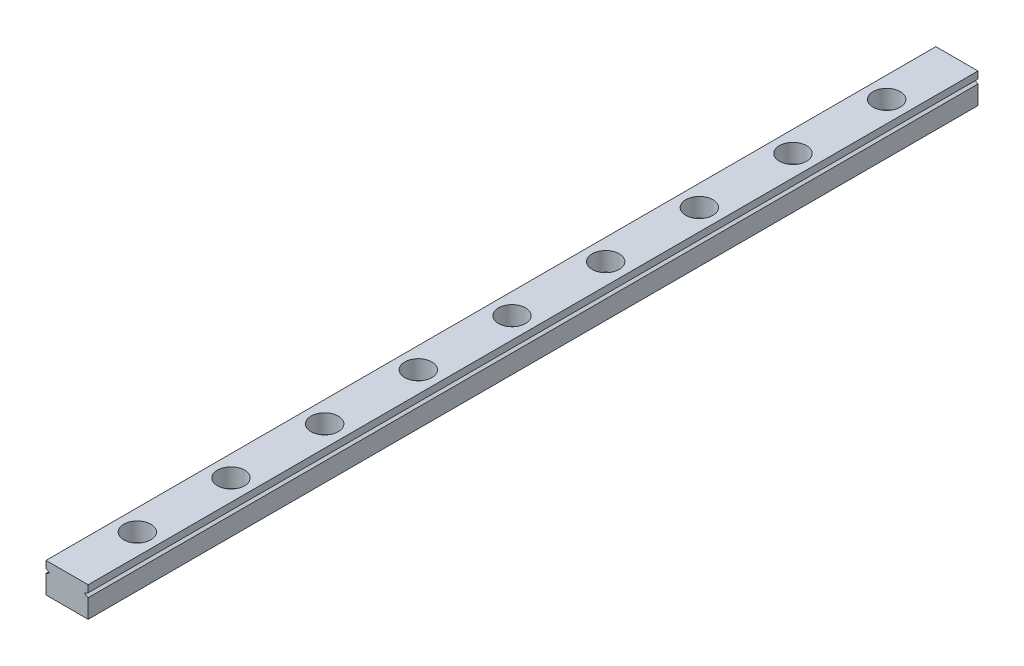
ISO-10303-21;
HEADER;
FILE_DESCRIPTION(('STEP AP214'),'2;1');
FILE_NAME('part.step','',(''),(''),'','','');
FILE_SCHEMA(('AUTOMOTIVE_DESIGN { 1 0 10303 214 1 1 1 1 }'));
ENDSEC;
DATA;
#1=APPLICATION_CONTEXT('core data for automotive mechanical design processes');
#2=APPLICATION_PROTOCOL_DEFINITION('international standard','automotive_design',2000,#1);
#3=PRODUCT_CONTEXT('',#1,'mechanical');
#4=PRODUCT('Part','Part','',(#3));
#5=PRODUCT_RELATED_PRODUCT_CATEGORY('part','',(#4));
#6=PRODUCT_DEFINITION_FORMATION('','',#4);
#7=PRODUCT_DEFINITION_CONTEXT('part definition',#1,'design');
#8=PRODUCT_DEFINITION('design','',#6,#7);
#9=PRODUCT_DEFINITION_SHAPE('','',#8);
#10=(LENGTH_UNIT() NAMED_UNIT(*) SI_UNIT(.MILLI.,.METRE.));
#11=(NAMED_UNIT(*) PLANE_ANGLE_UNIT() SI_UNIT($,.RADIAN.));
#12=(NAMED_UNIT(*) SI_UNIT($,.STERADIAN.) SOLID_ANGLE_UNIT());
#13=UNCERTAINTY_MEASURE_WITH_UNIT(LENGTH_MEASURE(1.E-05),#10,'distance_accuracy_value','');
#14=(GEOMETRIC_REPRESENTATION_CONTEXT(3) GLOBAL_UNCERTAINTY_ASSIGNED_CONTEXT((#13)) GLOBAL_UNIT_ASSIGNED_CONTEXT((#10,
#11,#12)) REPRESENTATION_CONTEXT('',''));
#15=CARTESIAN_POINT('',(0.,0.,0.));
#16=DIRECTION('',(0.,0.,1.));
#17=DIRECTION('',(1.,0.,0.));
#18=AXIS2_PLACEMENT_3D('',#15,#16,#17);
#19=CARTESIAN_POINT('',(0.,4.,190.));
#20=DIRECTION('',(1.,0.,0.));
#21=DIRECTION('',(0.,0.,-1.));
#22=AXIS2_PLACEMENT_3D('',#19,#20,#21);
#23=PLANE('',#22);
#24=DIRECTION('',(0.,-1.,0.));
#25=VECTOR('',#24,1.);
#26=CARTESIAN_POINT('',(0.,4.,0.));
#27=LINE('',#26,#25);
#28=CARTESIAN_POINT('',(0.,4.,0.));
#29=VERTEX_POINT('',#28);
#30=CARTESIAN_POINT('',(0.,0.,0.));
#31=VERTEX_POINT('',#30);
#32=EDGE_CURVE('E141',#29,#31,#27,.T.);
#33=ORIENTED_EDGE('',*,*,#32,.T.);
#34=DIRECTION('',(0.,0.,-1.));
#35=VECTOR('',#34,1.);
#36=CARTESIAN_POINT('',(0.,0.,190.));
#37=LINE('',#36,#35);
#38=CARTESIAN_POINT('',(0.,0.,190.));
#39=VERTEX_POINT('',#38);
#40=EDGE_CURVE('E11',#39,#31,#37,.T.);
#41=ORIENTED_EDGE('',*,*,#40,.F.);
#42=DIRECTION('',(0.,-1.,0.));
#43=VECTOR('',#42,1.);
#44=CARTESIAN_POINT('',(0.,4.,190.));
#45=LINE('',#44,#43);
#46=CARTESIAN_POINT('',(0.,4.,190.));
#47=VERTEX_POINT('',#46);
#48=EDGE_CURVE('E160',#47,#39,#45,.T.);
#49=ORIENTED_EDGE('',*,*,#48,.F.);
#50=DIRECTION('',(0.,0.,-1.));
#51=VECTOR('',#50,1.);
#52=CARTESIAN_POINT('',(0.,4.,190.));
#53=LINE('',#52,#51);
#54=EDGE_CURVE('E137',#47,#29,#53,.T.);
#55=ORIENTED_EDGE('',*,*,#54,.T.);
#56=EDGE_LOOP('',(#33,#41,#49,#55));
#57=FACE_BOUND('',#56,.T.);
#58=ADVANCED_FACE('F33',(#57),#23,.F.);
#59=CARTESIAN_POINT('',(0.,0.,190.));
#60=DIRECTION('',(0.,1.,0.));
#61=DIRECTION('',(0.,0.,1.));
#62=AXIS2_PLACEMENT_3D('',#59,#60,#61);
#63=PLANE('',#62);
#64=CARTESIAN_POINT('',(4.5,0.,175.));
#65=DIRECTION('',(0.,1.,0.));
#66=DIRECTION('',(0.,0.,1.));
#67=AXIS2_PLACEMENT_3D('',#64,#65,#66);
#68=CIRCLE('',#67,1.70000000000001);
#69=CARTESIAN_POINT('',(4.5,0.,176.7));
#70=VERTEX_POINT('',#69);
#71=EDGE_CURVE('E211',#70,#70,#68,.T.);
#72=ORIENTED_EDGE('',*,*,#71,.T.);
#73=EDGE_LOOP('',(#72));
#74=FACE_BOUND('',#73,.T.);
#75=CARTESIAN_POINT('',(4.49999999999993,0.,155.));
#76=DIRECTION('',(0.,1.,0.));
#77=DIRECTION('',(0.,0.,1.));
#78=AXIS2_PLACEMENT_3D('',#75,#76,#77);
#79=CIRCLE('',#78,1.70000000000001);
#80=CARTESIAN_POINT('',(4.49999999999993,0.,156.7));
#81=VERTEX_POINT('',#80);
#82=EDGE_CURVE('E306',#81,#81,#79,.T.);
#83=ORIENTED_EDGE('',*,*,#82,.T.);
#84=EDGE_LOOP('',(#83));
#85=FACE_BOUND('',#84,.T.);
#86=CARTESIAN_POINT('',(4.49999999999986,0.,135.));
#87=DIRECTION('',(0.,1.,0.));
#88=DIRECTION('',(0.,0.,1.));
#89=AXIS2_PLACEMENT_3D('',#86,#87,#88);
#90=CIRCLE('',#89,1.70000000000001);
#91=CARTESIAN_POINT('',(4.49999999999986,0.,136.7));
#92=VERTEX_POINT('',#91);
#93=EDGE_CURVE('E300',#92,#92,#90,.T.);
#94=ORIENTED_EDGE('',*,*,#93,.T.);
#95=EDGE_LOOP('',(#94));
#96=FACE_BOUND('',#95,.T.);
#97=CARTESIAN_POINT('',(4.49999999999979,0.,115.));
#98=DIRECTION('',(0.,1.,0.));
#99=DIRECTION('',(0.,0.,1.));
#100=AXIS2_PLACEMENT_3D('',#97,#98,#99);
#101=CIRCLE('',#100,1.70000000000001);
#102=CARTESIAN_POINT('',(4.49999999999979,0.,116.7));
#103=VERTEX_POINT('',#102);
#104=EDGE_CURVE('E294',#103,#103,#101,.T.);
#105=ORIENTED_EDGE('',*,*,#104,.T.);
#106=EDGE_LOOP('',(#105));
#107=FACE_BOUND('',#106,.T.);
#108=CARTESIAN_POINT('',(4.49999999999972,0.,95.));
#109=DIRECTION('',(0.,1.,0.));
#110=DIRECTION('',(0.,0.,1.));
#111=AXIS2_PLACEMENT_3D('',#108,#109,#110);
#112=CIRCLE('',#111,1.70000000000001);
#113=CARTESIAN_POINT('',(4.49999999999972,0.,96.7));
#114=VERTEX_POINT('',#113);
#115=EDGE_CURVE('E288',#114,#114,#112,.T.);
#116=ORIENTED_EDGE('',*,*,#115,.T.);
#117=EDGE_LOOP('',(#116));
#118=FACE_BOUND('',#117,.T.);
#119=CARTESIAN_POINT('',(4.49999999999965,0.,75.));
#120=DIRECTION('',(0.,1.,0.));
#121=DIRECTION('',(0.,0.,1.));
#122=AXIS2_PLACEMENT_3D('',#119,#120,#121);
#123=CIRCLE('',#122,1.70000000000001);
#124=CARTESIAN_POINT('',(4.49999999999965,0.,76.7));
#125=VERTEX_POINT('',#124);
#126=EDGE_CURVE('E282',#125,#125,#123,.T.);
#127=ORIENTED_EDGE('',*,*,#126,.T.);
#128=EDGE_LOOP('',(#127));
#129=FACE_BOUND('',#128,.T.);
#130=CARTESIAN_POINT('',(4.49999999999958,0.,55.));
#131=DIRECTION('',(0.,1.,0.));
#132=DIRECTION('',(0.,0.,1.));
#133=AXIS2_PLACEMENT_3D('',#130,#131,#132);
#134=CIRCLE('',#133,1.7);
#135=CARTESIAN_POINT('',(4.49999999999958,0.,56.7));
#136=VERTEX_POINT('',#135);
#137=EDGE_CURVE('E276',#136,#136,#134,.T.);
#138=ORIENTED_EDGE('',*,*,#137,.T.);
#139=EDGE_LOOP('',(#138));
#140=FACE_BOUND('',#139,.T.);
#141=CARTESIAN_POINT('',(4.49999999999951,0.,35.0000000000001));
#142=DIRECTION('',(0.,1.,0.));
#143=DIRECTION('',(0.,0.,1.));
#144=AXIS2_PLACEMENT_3D('',#141,#142,#143);
#145=CIRCLE('',#144,1.70000000000001);
#146=CARTESIAN_POINT('',(4.49999999999951,0.,36.7000000000001));
#147=VERTEX_POINT('',#146);
#148=EDGE_CURVE('E270',#147,#147,#145,.T.);
#149=ORIENTED_EDGE('',*,*,#148,.T.);
#150=EDGE_LOOP('',(#149));
#151=FACE_BOUND('',#150,.T.);
#152=CARTESIAN_POINT('',(4.49999999999944,0.,15.0000000000001));
#153=DIRECTION('',(0.,1.,0.));
#154=DIRECTION('',(0.,0.,1.));
#155=AXIS2_PLACEMENT_3D('',#152,#153,#154);
#156=CIRCLE('',#155,1.70000000000001);
#157=CARTESIAN_POINT('',(4.49999999999944,0.,16.7000000000001));
#158=VERTEX_POINT('',#157);
#159=EDGE_CURVE('E264',#158,#158,#156,.T.);
#160=ORIENTED_EDGE('',*,*,#159,.T.);
#161=EDGE_LOOP('',(#160));
#162=FACE_BOUND('',#161,.T.);
#163=DIRECTION('',(1.,0.,0.));
#164=VECTOR('',#163,1.);
#165=CARTESIAN_POINT('',(0.,0.,0.));
#166=LINE('',#165,#164);
#167=CARTESIAN_POINT('',(9.,0.,0.));
#168=VERTEX_POINT('',#167);
#169=EDGE_CURVE('E144',#31,#168,#166,.T.);
#170=ORIENTED_EDGE('',*,*,#169,.T.);
#171=DIRECTION('',(0.,0.,-1.));
#172=VECTOR('',#171,1.);
#173=CARTESIAN_POINT('',(9.,0.,190.));
#174=LINE('',#173,#172);
#175=CARTESIAN_POINT('',(9.,0.,190.));
#176=VERTEX_POINT('',#175);
#177=EDGE_CURVE('E41',#176,#168,#174,.T.);
#178=ORIENTED_EDGE('',*,*,#177,.F.);
#179=DIRECTION('',(1.,0.,0.));
#180=VECTOR('',#179,1.);
#181=CARTESIAN_POINT('',(0.,0.,190.));
#182=LINE('',#181,#180);
#183=EDGE_CURVE('E98',#39,#176,#182,.T.);
#184=ORIENTED_EDGE('',*,*,#183,.F.);
#185=ORIENTED_EDGE('',*,*,#40,.T.);
#186=EDGE_LOOP('',(#170,#178,#184,#185));
#187=FACE_BOUND('',#186,.T.);
#188=ADVANCED_FACE('F315',(#74,#85,#96,#107,#118,#129,#140,#151,#162,#187),#63,.F.);
#189=CARTESIAN_POINT('',(9.,4.,190.));
#190=DIRECTION('',(-1.,0.,0.));
#191=DIRECTION('',(0.,-1.,0.));
#192=AXIS2_PLACEMENT_3D('',#189,#190,#191);
#193=PLANE('',#192);
#194=DIRECTION('',(0.,1.,0.));
#195=VECTOR('',#194,1.);
#196=CARTESIAN_POINT('',(9.,4.,0.));
#197=LINE('',#196,#195);
#198=CARTESIAN_POINT('',(9.,4.,0.));
#199=VERTEX_POINT('',#198);
#200=EDGE_CURVE('E147',#168,#199,#197,.T.);
#201=ORIENTED_EDGE('',*,*,#200,.T.);
#202=DIRECTION('',(0.,0.,-1.));
#203=VECTOR('',#202,1.);
#204=CARTESIAN_POINT('',(9.,4.,190.));
#205=LINE('',#204,#203);
#206=CARTESIAN_POINT('',(9.,4.,190.));
#207=VERTEX_POINT('',#206);
#208=EDGE_CURVE('E173',#207,#199,#205,.T.);
#209=ORIENTED_EDGE('',*,*,#208,.F.);
#210=DIRECTION('',(0.,1.,0.));
#211=VECTOR('',#210,1.);
#212=CARTESIAN_POINT('',(9.,4.,190.));
#213=LINE('',#212,#211);
#214=EDGE_CURVE('E181',#176,#207,#213,.T.);
#215=ORIENTED_EDGE('',*,*,#214,.F.);
#216=ORIENTED_EDGE('',*,*,#177,.T.);
#217=EDGE_LOOP('',(#201,#209,#215,#216));
#218=FACE_BOUND('',#217,.T.);
#219=ADVANCED_FACE('F179',(#218),#193,.F.);
#220=CARTESIAN_POINT('',(8.2,4.45,190.));
#221=DIRECTION('',(-0.490261239632559,-0.871575537124549,0.));
#222=DIRECTION('',(0.871575537124549,-0.490261239632559,0.));
#223=AXIS2_PLACEMENT_3D('',#220,#221,#222);
#224=PLANE('',#223);
#225=DIRECTION('',(-0.871575537124549,0.490261239632559,0.));
#226=VECTOR('',#225,1.);
#227=CARTESIAN_POINT('',(8.2,4.45,0.));
#228=LINE('',#227,#226);
#229=CARTESIAN_POINT('',(8.2,4.45,0.));
#230=VERTEX_POINT('',#229);
#231=EDGE_CURVE('E149',#199,#230,#228,.T.);
#232=ORIENTED_EDGE('',*,*,#231,.T.);
#233=DIRECTION('',(0.,0.,-1.));
#234=VECTOR('',#233,1.);
#235=CARTESIAN_POINT('',(8.2,4.45,190.));
#236=LINE('',#235,#234);
#237=CARTESIAN_POINT('',(8.2,4.45,190.));
#238=VERTEX_POINT('',#237);
#239=EDGE_CURVE('E170',#238,#230,#236,.T.);
#240=ORIENTED_EDGE('',*,*,#239,.F.);
#241=DIRECTION('',(-0.871575537124549,0.490261239632559,0.));
#242=VECTOR('',#241,1.);
#243=CARTESIAN_POINT('',(8.2,4.45,190.));
#244=LINE('',#243,#242);
#245=EDGE_CURVE('E199',#207,#238,#244,.T.);
#246=ORIENTED_EDGE('',*,*,#245,.F.);
#247=ORIENTED_EDGE('',*,*,#208,.T.);
#248=EDGE_LOOP('',(#232,#240,#246,#247));
#249=FACE_BOUND('',#248,.T.);
#250=ADVANCED_FACE('F190',(#249),#224,.F.);
#251=CARTESIAN_POINT('',(9.,4.9,190.));
#252=DIRECTION('',(-0.490261239632559,0.871575537124549,0.));
#253=DIRECTION('',(-0.871575537124549,-0.490261239632559,0.));
#254=AXIS2_PLACEMENT_3D('',#251,#252,#253);
#255=PLANE('',#254);
#256=DIRECTION('',(0.871575537124549,0.490261239632559,0.));
#257=VECTOR('',#256,1.);
#258=CARTESIAN_POINT('',(9.,4.9,0.));
#259=LINE('',#258,#257);
#260=CARTESIAN_POINT('',(9.,4.9,0.));
#261=VERTEX_POINT('',#260);
#262=EDGE_CURVE('E151',#230,#261,#259,.T.);
#263=ORIENTED_EDGE('',*,*,#262,.T.);
#264=DIRECTION('',(0.,0.,-1.));
#265=VECTOR('',#264,1.);
#266=CARTESIAN_POINT('',(9.,4.9,190.));
#267=LINE('',#266,#265);
#268=CARTESIAN_POINT('',(9.,4.9,190.));
#269=VERTEX_POINT('',#268);
#270=EDGE_CURVE('E167',#269,#261,#267,.T.);
#271=ORIENTED_EDGE('',*,*,#270,.F.);
#272=DIRECTION('',(0.871575537124549,0.490261239632559,0.));
#273=VECTOR('',#272,1.);
#274=CARTESIAN_POINT('',(9.,4.9,190.));
#275=LINE('',#274,#273);
#276=EDGE_CURVE('E196',#238,#269,#275,.T.);
#277=ORIENTED_EDGE('',*,*,#276,.F.);
#278=ORIENTED_EDGE('',*,*,#239,.T.);
#279=EDGE_LOOP('',(#263,#271,#277,#278));
#280=FACE_BOUND('',#279,.T.);
#281=ADVANCED_FACE('F194',(#280),#255,.F.);
#282=CARTESIAN_POINT('',(9.,6.4,190.));
#283=DIRECTION('',(-1.,0.,0.));
#284=DIRECTION('',(0.,0.,1.));
#285=AXIS2_PLACEMENT_3D('',#282,#283,#284);
#286=PLANE('',#285);
#287=DIRECTION('',(0.,1.,0.));
#288=VECTOR('',#287,1.);
#289=CARTESIAN_POINT('',(9.,6.4,0.));
#290=LINE('',#289,#288);
#291=CARTESIAN_POINT('',(9.,6.4,0.));
#292=VERTEX_POINT('',#291);
#293=EDGE_CURVE('E153',#261,#292,#290,.T.);
#294=ORIENTED_EDGE('',*,*,#293,.T.);
#295=DIRECTION('',(0.,0.,-1.));
#296=VECTOR('',#295,1.);
#297=CARTESIAN_POINT('',(9.,6.4,190.));
#298=LINE('',#297,#296);
#299=CARTESIAN_POINT('',(9.,6.4,190.));
#300=VERTEX_POINT('',#299);
#301=EDGE_CURVE('E164',#300,#292,#298,.T.);
#302=ORIENTED_EDGE('',*,*,#301,.F.);
#303=DIRECTION('',(0.,1.,0.));
#304=VECTOR('',#303,1.);
#305=CARTESIAN_POINT('',(9.,6.4,190.));
#306=LINE('',#305,#304);
#307=EDGE_CURVE('E198',#269,#300,#306,.T.);
#308=ORIENTED_EDGE('',*,*,#307,.F.);
#309=ORIENTED_EDGE('',*,*,#270,.T.);
#310=EDGE_LOOP('',(#294,#302,#308,#309));
#311=FACE_BOUND('',#310,.T.);
#312=ADVANCED_FACE('F342',(#311),#286,.F.);
#313=CARTESIAN_POINT('',(0.,6.4,190.));
#314=DIRECTION('',(0.,-1.,0.));
#315=DIRECTION('',(0.,0.,-1.));
#316=AXIS2_PLACEMENT_3D('',#313,#314,#315);
#317=PLANE('',#316);
#318=CARTESIAN_POINT('',(4.5,6.4,175.));
#319=DIRECTION('',(0.,1.,0.));
#320=DIRECTION('',(0.,0.,1.));
#321=AXIS2_PLACEMENT_3D('',#318,#319,#320);
#322=CIRCLE('',#321,2.90000000000001);
#323=CARTESIAN_POINT('',(4.5,6.4,177.9));
#324=VERTEX_POINT('',#323);
#325=EDGE_CURVE('E256',#324,#324,#322,.T.);
#326=ORIENTED_EDGE('',*,*,#325,.F.);
#327=EDGE_LOOP('',(#326));
#328=FACE_BOUND('',#327,.T.);
#329=CARTESIAN_POINT('',(4.49999999999993,6.4,155.));
#330=DIRECTION('',(0.,1.,0.));
#331=DIRECTION('',(0.,0.,1.));
#332=AXIS2_PLACEMENT_3D('',#329,#330,#331);
#333=CIRCLE('',#332,2.90000000000001);
#334=CARTESIAN_POINT('',(4.49999999999993,6.4,157.9));
#335=VERTEX_POINT('',#334);
#336=EDGE_CURVE('E250',#335,#335,#333,.T.);
#337=ORIENTED_EDGE('',*,*,#336,.F.);
#338=EDGE_LOOP('',(#337));
#339=FACE_BOUND('',#338,.T.);
#340=CARTESIAN_POINT('',(4.49999999999986,6.4,135.));
#341=DIRECTION('',(0.,1.,0.));
#342=DIRECTION('',(0.,0.,1.));
#343=AXIS2_PLACEMENT_3D('',#340,#341,#342);
#344=CIRCLE('',#343,2.90000000000001);
#345=CARTESIAN_POINT('',(4.49999999999986,6.4,137.9));
#346=VERTEX_POINT('',#345);
#347=EDGE_CURVE('E244',#346,#346,#344,.T.);
#348=ORIENTED_EDGE('',*,*,#347,.F.);
#349=EDGE_LOOP('',(#348));
#350=FACE_BOUND('',#349,.T.);
#351=CARTESIAN_POINT('',(4.49999999999979,6.4,115.));
#352=DIRECTION('',(0.,1.,0.));
#353=DIRECTION('',(0.,0.,1.));
#354=AXIS2_PLACEMENT_3D('',#351,#352,#353);
#355=CIRCLE('',#354,2.9);
#356=CARTESIAN_POINT('',(4.49999999999979,6.4,117.9));
#357=VERTEX_POINT('',#356);
#358=EDGE_CURVE('E238',#357,#357,#355,.T.);
#359=ORIENTED_EDGE('',*,*,#358,.F.);
#360=EDGE_LOOP('',(#359));
#361=FACE_BOUND('',#360,.T.);
#362=CARTESIAN_POINT('',(4.49999999999972,6.4,95.));
#363=DIRECTION('',(0.,1.,0.));
#364=DIRECTION('',(0.,0.,1.));
#365=AXIS2_PLACEMENT_3D('',#362,#363,#364);
#366=CIRCLE('',#365,2.9);
#367=CARTESIAN_POINT('',(4.49999999999972,6.4,97.9));
#368=VERTEX_POINT('',#367);
#369=EDGE_CURVE('E232',#368,#368,#366,.T.);
#370=ORIENTED_EDGE('',*,*,#369,.F.);
#371=EDGE_LOOP('',(#370));
#372=FACE_BOUND('',#371,.T.);
#373=CARTESIAN_POINT('',(4.49999999999965,6.4,75.));
#374=DIRECTION('',(0.,1.,0.));
#375=DIRECTION('',(0.,0.,1.));
#376=AXIS2_PLACEMENT_3D('',#373,#374,#375);
#377=CIRCLE('',#376,2.9);
#378=CARTESIAN_POINT('',(4.49999999999965,6.4,77.9));
#379=VERTEX_POINT('',#378);
#380=EDGE_CURVE('E226',#379,#379,#377,.T.);
#381=ORIENTED_EDGE('',*,*,#380,.F.);
#382=EDGE_LOOP('',(#381));
#383=FACE_BOUND('',#382,.T.);
#384=CARTESIAN_POINT('',(4.49999999999958,6.4,55.));
#385=DIRECTION('',(0.,1.,0.));
#386=DIRECTION('',(0.,0.,1.));
#387=AXIS2_PLACEMENT_3D('',#384,#385,#386);
#388=CIRCLE('',#387,2.9);
#389=CARTESIAN_POINT('',(4.49999999999958,6.4,57.9));
#390=VERTEX_POINT('',#389);
#391=EDGE_CURVE('E220',#390,#390,#388,.T.);
#392=ORIENTED_EDGE('',*,*,#391,.F.);
#393=EDGE_LOOP('',(#392));
#394=FACE_BOUND('',#393,.T.);
#395=CARTESIAN_POINT('',(4.49999999999951,6.4,35.0000000000001));
#396=DIRECTION('',(0.,1.,0.));
#397=DIRECTION('',(0.,0.,1.));
#398=AXIS2_PLACEMENT_3D('',#395,#396,#397);
#399=CIRCLE('',#398,2.90000000000001);
#400=CARTESIAN_POINT('',(4.49999999999951,6.4,37.9000000000001));
#401=VERTEX_POINT('',#400);
#402=EDGE_CURVE('E214',#401,#401,#399,.T.);
#403=ORIENTED_EDGE('',*,*,#402,.F.);
#404=EDGE_LOOP('',(#403));
#405=FACE_BOUND('',#404,.T.);
#406=CARTESIAN_POINT('',(4.49999999999944,6.4,15.0000000000001));
#407=DIRECTION('',(0.,1.,0.));
#408=DIRECTION('',(0.,0.,1.));
#409=AXIS2_PLACEMENT_3D('',#406,#407,#408);
#410=CIRCLE('',#409,2.90000000000001);
#411=CARTESIAN_POINT('',(4.49999999999944,6.4,17.9000000000001));
#412=VERTEX_POINT('',#411);
#413=EDGE_CURVE('E207',#412,#412,#410,.T.);
#414=ORIENTED_EDGE('',*,*,#413,.F.);
#415=EDGE_LOOP('',(#414));
#416=FACE_BOUND('',#415,.T.);
#417=DIRECTION('',(-1.,0.,0.));
#418=VECTOR('',#417,1.);
#419=CARTESIAN_POINT('',(0.,6.4,0.));
#420=LINE('',#419,#418);
#421=CARTESIAN_POINT('',(0.,6.4,0.));
#422=VERTEX_POINT('',#421);
#423=EDGE_CURVE('E155',#292,#422,#420,.T.);
#424=ORIENTED_EDGE('',*,*,#423,.T.);
#425=DIRECTION('',(0.,0.,-1.));
#426=VECTOR('',#425,1.);
#427=CARTESIAN_POINT('',(0.,6.4,190.));
#428=LINE('',#427,#426);
#429=CARTESIAN_POINT('',(0.,6.4,190.));
#430=VERTEX_POINT('',#429);
#431=EDGE_CURVE('E132',#430,#422,#428,.T.);
#432=ORIENTED_EDGE('',*,*,#431,.F.);
#433=DIRECTION('',(-1.,0.,0.));
#434=VECTOR('',#433,1.);
#435=CARTESIAN_POINT('',(0.,6.4,190.));
#436=LINE('',#435,#434);
#437=EDGE_CURVE('E123',#300,#430,#436,.T.);
#438=ORIENTED_EDGE('',*,*,#437,.F.);
#439=ORIENTED_EDGE('',*,*,#301,.T.);
#440=EDGE_LOOP('',(#424,#432,#438,#439));
#441=FACE_BOUND('',#440,.T.);
#442=ADVANCED_FACE('F339',(#328,#339,#350,#361,#372,#383,#394,#405,#416,#441),#317,.F.);
#443=CARTESIAN_POINT('',(0.,6.4,190.));
#444=DIRECTION('',(1.,0.,0.));
#445=DIRECTION('',(0.,1.,0.));
#446=AXIS2_PLACEMENT_3D('',#443,#444,#445);
#447=PLANE('',#446);
#448=DIRECTION('',(0.,-1.,0.));
#449=VECTOR('',#448,1.);
#450=CARTESIAN_POINT('',(0.,6.4,0.));
#451=LINE('',#450,#449);
#452=CARTESIAN_POINT('',(0.,4.9,0.));
#453=VERTEX_POINT('',#452);
#454=EDGE_CURVE('E131',#422,#453,#451,.T.);
#455=ORIENTED_EDGE('',*,*,#454,.T.);
#456=DIRECTION('',(0.,0.,-1.));
#457=VECTOR('',#456,1.);
#458=CARTESIAN_POINT('',(0.,4.9,190.));
#459=LINE('',#458,#457);
#460=CARTESIAN_POINT('',(0.,4.9,190.));
#461=VERTEX_POINT('',#460);
#462=EDGE_CURVE('E128',#461,#453,#459,.T.);
#463=ORIENTED_EDGE('',*,*,#462,.F.);
#464=DIRECTION('',(0.,-1.,0.));
#465=VECTOR('',#464,1.);
#466=CARTESIAN_POINT('',(0.,6.4,190.));
#467=LINE('',#466,#465);
#468=EDGE_CURVE('E117',#430,#461,#467,.T.);
#469=ORIENTED_EDGE('',*,*,#468,.F.);
#470=ORIENTED_EDGE('',*,*,#431,.T.);
#471=EDGE_LOOP('',(#455,#463,#469,#470));
#472=FACE_BOUND('',#471,.T.);
#473=ADVANCED_FACE('F129',(#472),#447,.F.);
#474=CARTESIAN_POINT('',(0.,4.9,190.));
#475=DIRECTION('',(0.490261239632558,0.87157553712455,0.));
#476=DIRECTION('',(-0.87157553712455,0.490261239632558,0.));
#477=AXIS2_PLACEMENT_3D('',#474,#475,#476);
#478=PLANE('',#477);
#479=DIRECTION('',(0.87157553712455,-0.490261239632558,0.));
#480=VECTOR('',#479,1.);
#481=CARTESIAN_POINT('',(0.,4.9,0.));
#482=LINE('',#481,#480);
#483=CARTESIAN_POINT('',(0.800000000000001,4.45,0.));
#484=VERTEX_POINT('',#483);
#485=EDGE_CURVE('E84',#453,#484,#482,.T.);
#486=ORIENTED_EDGE('',*,*,#485,.T.);
#487=DIRECTION('',(0.,0.,-1.));
#488=VECTOR('',#487,1.);
#489=CARTESIAN_POINT('',(0.800000000000001,4.45,190.));
#490=LINE('',#489,#488);
#491=CARTESIAN_POINT('',(0.800000000000001,4.45,190.));
#492=VERTEX_POINT('',#491);
#493=EDGE_CURVE('E133',#492,#484,#490,.T.);
#494=ORIENTED_EDGE('',*,*,#493,.F.);
#495=DIRECTION('',(0.87157553712455,-0.490261239632558,0.));
#496=VECTOR('',#495,1.);
#497=CARTESIAN_POINT('',(0.,4.9,190.));
#498=LINE('',#497,#496);
#499=EDGE_CURVE('E121',#461,#492,#498,.T.);
#500=ORIENTED_EDGE('',*,*,#499,.F.);
#501=ORIENTED_EDGE('',*,*,#462,.T.);
#502=EDGE_LOOP('',(#486,#494,#500,#501));
#503=FACE_BOUND('',#502,.T.);
#504=ADVANCED_FACE('F135',(#503),#478,.F.);
#505=CARTESIAN_POINT('',(0.800000000000001,4.45,190.));
#506=DIRECTION('',(0.490261239632558,-0.87157553712455,0.));
#507=DIRECTION('',(0.87157553712455,0.490261239632558,0.));
#508=AXIS2_PLACEMENT_3D('',#505,#506,#507);
#509=PLANE('',#508);
#510=DIRECTION('',(-0.87157553712455,-0.490261239632558,0.));
#511=VECTOR('',#510,1.);
#512=CARTESIAN_POINT('',(0.800000000000001,4.45,0.));
#513=LINE('',#512,#511);
#514=EDGE_CURVE('E90',#484,#29,#513,.T.);
#515=ORIENTED_EDGE('',*,*,#514,.T.);
#516=ORIENTED_EDGE('',*,*,#54,.F.);
#517=DIRECTION('',(-0.87157553712455,-0.490261239632558,0.));
#518=VECTOR('',#517,1.);
#519=CARTESIAN_POINT('',(0.800000000000001,4.45,190.));
#520=LINE('',#519,#518);
#521=EDGE_CURVE('E49',#492,#47,#520,.T.);
#522=ORIENTED_EDGE('',*,*,#521,.F.);
#523=ORIENTED_EDGE('',*,*,#493,.T.);
#524=EDGE_LOOP('',(#515,#516,#522,#523));
#525=FACE_BOUND('',#524,.T.);
#526=ADVANCED_FACE('F365',(#525),#509,.F.);
#527=CARTESIAN_POINT('',(0.,0.,190.));
#528=DIRECTION('',(0.,0.,1.));
#529=DIRECTION('',(1.,0.,0.));
#530=AXIS2_PLACEMENT_3D('',#527,#528,#529);
#531=PLANE('',#530);
#532=ORIENTED_EDGE('',*,*,#48,.T.);
#533=ORIENTED_EDGE('',*,*,#183,.T.);
#534=ORIENTED_EDGE('',*,*,#214,.T.);
#535=ORIENTED_EDGE('',*,*,#245,.T.);
#536=ORIENTED_EDGE('',*,*,#276,.T.);
#537=ORIENTED_EDGE('',*,*,#307,.T.);
#538=ORIENTED_EDGE('',*,*,#437,.T.);
#539=ORIENTED_EDGE('',*,*,#468,.T.);
#540=ORIENTED_EDGE('',*,*,#499,.T.);
#541=ORIENTED_EDGE('',*,*,#521,.T.);
#542=EDGE_LOOP('',(#532,#533,#534,#535,#536,#537,#538,#539,#540,#541));
#543=FACE_BOUND('',#542,.T.);
#544=ADVANCED_FACE('F119',(#543),#531,.T.);
#545=CARTESIAN_POINT('',(0.,0.,0.));
#546=DIRECTION('',(0.,0.,1.));
#547=DIRECTION('',(1.,0.,0.));
#548=AXIS2_PLACEMENT_3D('',#545,#546,#547);
#549=PLANE('',#548);
#550=ORIENTED_EDGE('',*,*,#32,.F.);
#551=ORIENTED_EDGE('',*,*,#514,.F.);
#552=ORIENTED_EDGE('',*,*,#485,.F.);
#553=ORIENTED_EDGE('',*,*,#454,.F.);
#554=ORIENTED_EDGE('',*,*,#423,.F.);
#555=ORIENTED_EDGE('',*,*,#293,.F.);
#556=ORIENTED_EDGE('',*,*,#262,.F.);
#557=ORIENTED_EDGE('',*,*,#231,.F.);
#558=ORIENTED_EDGE('',*,*,#200,.F.);
#559=ORIENTED_EDGE('',*,*,#169,.F.);
#560=EDGE_LOOP('',(#550,#551,#552,#553,#554,#555,#556,#557,#558,#559));
#561=FACE_BOUND('',#560,.T.);
#562=ADVANCED_FACE('F185',(#561),#549,.F.);
#563=CARTESIAN_POINT('',(4.49999999999944,2.4,15.0000000000001));
#564=DIRECTION('',(0.,1.,0.));
#565=DIRECTION('',(0.,0.,1.));
#566=AXIS2_PLACEMENT_3D('',#563,#564,#565);
#567=CYLINDRICAL_SURFACE('',#566,2.90000000000001);
#568=CARTESIAN_POINT('',(4.49999999999944,2.4,15.0000000000001));
#569=DIRECTION('',(0.,1.,0.));
#570=DIRECTION('',(0.,0.,1.));
#571=AXIS2_PLACEMENT_3D('',#568,#569,#570);
#572=CIRCLE('',#571,2.90000000000001);
#573=CARTESIAN_POINT('',(4.49999999999944,2.4,17.9000000000001));
#574=VERTEX_POINT('',#573);
#575=EDGE_CURVE('E210',#574,#574,#572,.T.);
#576=ORIENTED_EDGE('',*,*,#575,.F.);
#577=EDGE_LOOP('',(#576));
#578=FACE_BOUND('',#577,.T.);
#579=ORIENTED_EDGE('',*,*,#413,.T.);
#580=EDGE_LOOP('',(#579));
#581=FACE_BOUND('',#580,.T.);
#582=ADVANCED_FACE('F419',(#578,#581),#567,.F.);
#583=CARTESIAN_POINT('',(4.49999999999944,2.4,15.0000000000001));
#584=DIRECTION('',(0.,1.,0.));
#585=DIRECTION('',(0.,0.,1.));
#586=AXIS2_PLACEMENT_3D('',#583,#584,#585);
#587=PLANE('',#586);
#588=CARTESIAN_POINT('',(4.49999999999944,2.4,15.0000000000001));
#589=DIRECTION('',(0.,1.,0.));
#590=DIRECTION('',(0.,0.,1.));
#591=AXIS2_PLACEMENT_3D('',#588,#589,#590);
#592=CIRCLE('',#591,1.70000000000001);
#593=CARTESIAN_POINT('',(4.49999999999944,2.4,16.7000000000001));
#594=VERTEX_POINT('',#593);
#595=EDGE_CURVE('E261',#594,#594,#592,.T.);
#596=ORIENTED_EDGE('',*,*,#595,.F.);
#597=EDGE_LOOP('',(#596));
#598=FACE_BOUND('',#597,.T.);
#599=ORIENTED_EDGE('',*,*,#575,.T.);
#600=EDGE_LOOP('',(#599));
#601=FACE_BOUND('',#600,.T.);
#602=ADVANCED_FACE('F433',(#598,#601),#587,.T.);
#603=CARTESIAN_POINT('',(4.49999999999951,2.4,35.0000000000001));
#604=DIRECTION('',(0.,1.,0.));
#605=DIRECTION('',(0.,0.,1.));
#606=AXIS2_PLACEMENT_3D('',#603,#604,#605);
#607=CYLINDRICAL_SURFACE('',#606,2.90000000000001);
#608=CARTESIAN_POINT('',(4.49999999999951,2.4,35.0000000000001));
#609=DIRECTION('',(0.,1.,0.));
#610=DIRECTION('',(0.,0.,1.));
#611=AXIS2_PLACEMENT_3D('',#608,#609,#610);
#612=CIRCLE('',#611,2.90000000000001);
#613=CARTESIAN_POINT('',(4.49999999999951,2.4,37.9000000000001));
#614=VERTEX_POINT('',#613);
#615=EDGE_CURVE('E217',#614,#614,#612,.T.);
#616=ORIENTED_EDGE('',*,*,#615,.F.);
#617=EDGE_LOOP('',(#616));
#618=FACE_BOUND('',#617,.T.);
#619=ORIENTED_EDGE('',*,*,#402,.T.);
#620=EDGE_LOOP('',(#619));
#621=FACE_BOUND('',#620,.T.);
#622=ADVANCED_FACE('F441',(#618,#621),#607,.F.);
#623=CARTESIAN_POINT('',(4.49999999999951,2.4,35.0000000000001));
#624=DIRECTION('',(0.,1.,0.));
#625=DIRECTION('',(0.,0.,1.));
#626=AXIS2_PLACEMENT_3D('',#623,#624,#625);
#627=PLANE('',#626);
#628=CARTESIAN_POINT('',(4.49999999999951,2.4,35.0000000000001));
#629=DIRECTION('',(0.,1.,0.));
#630=DIRECTION('',(0.,0.,1.));
#631=AXIS2_PLACEMENT_3D('',#628,#629,#630);
#632=CIRCLE('',#631,1.70000000000001);
#633=CARTESIAN_POINT('',(4.49999999999951,2.4,36.7000000000001));
#634=VERTEX_POINT('',#633);
#635=EDGE_CURVE('E267',#634,#634,#632,.T.);
#636=ORIENTED_EDGE('',*,*,#635,.F.);
#637=EDGE_LOOP('',(#636));
#638=FACE_BOUND('',#637,.T.);
#639=ORIENTED_EDGE('',*,*,#615,.T.);
#640=EDGE_LOOP('',(#639));
#641=FACE_BOUND('',#640,.T.);
#642=ADVANCED_FACE('F446',(#638,#641),#627,.T.);
#643=CARTESIAN_POINT('',(4.49999999999958,2.4,55.));
#644=DIRECTION('',(0.,1.,0.));
#645=DIRECTION('',(0.,0.,1.));
#646=AXIS2_PLACEMENT_3D('',#643,#644,#645);
#647=CYLINDRICAL_SURFACE('',#646,2.9);
#648=CARTESIAN_POINT('',(4.49999999999958,2.4,55.));
#649=DIRECTION('',(0.,1.,0.));
#650=DIRECTION('',(0.,0.,1.));
#651=AXIS2_PLACEMENT_3D('',#648,#649,#650);
#652=CIRCLE('',#651,2.9);
#653=CARTESIAN_POINT('',(4.49999999999958,2.4,57.9));
#654=VERTEX_POINT('',#653);
#655=EDGE_CURVE('E223',#654,#654,#652,.T.);
#656=ORIENTED_EDGE('',*,*,#655,.F.);
#657=EDGE_LOOP('',(#656));
#658=FACE_BOUND('',#657,.T.);
#659=ORIENTED_EDGE('',*,*,#391,.T.);
#660=EDGE_LOOP('',(#659));
#661=FACE_BOUND('',#660,.T.);
#662=ADVANCED_FACE('F454',(#658,#661),#647,.F.);
#663=CARTESIAN_POINT('',(4.49999999999958,2.4,55.));
#664=DIRECTION('',(0.,1.,0.));
#665=DIRECTION('',(0.,0.,1.));
#666=AXIS2_PLACEMENT_3D('',#663,#664,#665);
#667=PLANE('',#666);
#668=CARTESIAN_POINT('',(4.49999999999958,2.4,55.));
#669=DIRECTION('',(0.,1.,0.));
#670=DIRECTION('',(0.,0.,1.));
#671=AXIS2_PLACEMENT_3D('',#668,#669,#670);
#672=CIRCLE('',#671,1.7);
#673=CARTESIAN_POINT('',(4.49999999999958,2.4,56.7));
#674=VERTEX_POINT('',#673);
#675=EDGE_CURVE('E273',#674,#674,#672,.T.);
#676=ORIENTED_EDGE('',*,*,#675,.F.);
#677=EDGE_LOOP('',(#676));
#678=FACE_BOUND('',#677,.T.);
#679=ORIENTED_EDGE('',*,*,#655,.T.);
#680=EDGE_LOOP('',(#679));
#681=FACE_BOUND('',#680,.T.);
#682=ADVANCED_FACE('F459',(#678,#681),#667,.T.);
#683=CARTESIAN_POINT('',(4.49999999999965,2.4,75.));
#684=DIRECTION('',(0.,1.,0.));
#685=DIRECTION('',(0.,0.,1.));
#686=AXIS2_PLACEMENT_3D('',#683,#684,#685);
#687=CYLINDRICAL_SURFACE('',#686,2.9);
#688=CARTESIAN_POINT('',(4.49999999999965,2.4,75.));
#689=DIRECTION('',(0.,1.,0.));
#690=DIRECTION('',(0.,0.,1.));
#691=AXIS2_PLACEMENT_3D('',#688,#689,#690);
#692=CIRCLE('',#691,2.9);
#693=CARTESIAN_POINT('',(4.49999999999965,2.4,77.9));
#694=VERTEX_POINT('',#693);
#695=EDGE_CURVE('E229',#694,#694,#692,.T.);
#696=ORIENTED_EDGE('',*,*,#695,.F.);
#697=EDGE_LOOP('',(#696));
#698=FACE_BOUND('',#697,.T.);
#699=ORIENTED_EDGE('',*,*,#380,.T.);
#700=EDGE_LOOP('',(#699));
#701=FACE_BOUND('',#700,.T.);
#702=ADVANCED_FACE('F467',(#698,#701),#687,.F.);
#703=CARTESIAN_POINT('',(4.49999999999965,2.4,75.));
#704=DIRECTION('',(0.,1.,0.));
#705=DIRECTION('',(0.,0.,1.));
#706=AXIS2_PLACEMENT_3D('',#703,#704,#705);
#707=PLANE('',#706);
#708=CARTESIAN_POINT('',(4.49999999999965,2.4,75.));
#709=DIRECTION('',(0.,1.,0.));
#710=DIRECTION('',(0.,0.,1.));
#711=AXIS2_PLACEMENT_3D('',#708,#709,#710);
#712=CIRCLE('',#711,1.70000000000001);
#713=CARTESIAN_POINT('',(4.49999999999965,2.4,76.7));
#714=VERTEX_POINT('',#713);
#715=EDGE_CURVE('E279',#714,#714,#712,.T.);
#716=ORIENTED_EDGE('',*,*,#715,.F.);
#717=EDGE_LOOP('',(#716));
#718=FACE_BOUND('',#717,.T.);
#719=ORIENTED_EDGE('',*,*,#695,.T.);
#720=EDGE_LOOP('',(#719));
#721=FACE_BOUND('',#720,.T.);
#722=ADVANCED_FACE('F472',(#718,#721),#707,.T.);
#723=CARTESIAN_POINT('',(4.49999999999972,2.4,95.));
#724=DIRECTION('',(0.,1.,0.));
#725=DIRECTION('',(0.,0.,1.));
#726=AXIS2_PLACEMENT_3D('',#723,#724,#725);
#727=CYLINDRICAL_SURFACE('',#726,2.9);
#728=CARTESIAN_POINT('',(4.49999999999972,2.4,95.));
#729=DIRECTION('',(0.,1.,0.));
#730=DIRECTION('',(0.,0.,1.));
#731=AXIS2_PLACEMENT_3D('',#728,#729,#730);
#732=CIRCLE('',#731,2.9);
#733=CARTESIAN_POINT('',(4.49999999999972,2.4,97.9));
#734=VERTEX_POINT('',#733);
#735=EDGE_CURVE('E235',#734,#734,#732,.T.);
#736=ORIENTED_EDGE('',*,*,#735,.F.);
#737=EDGE_LOOP('',(#736));
#738=FACE_BOUND('',#737,.T.);
#739=ORIENTED_EDGE('',*,*,#369,.T.);
#740=EDGE_LOOP('',(#739));
#741=FACE_BOUND('',#740,.T.);
#742=ADVANCED_FACE('F480',(#738,#741),#727,.F.);
#743=CARTESIAN_POINT('',(4.49999999999972,2.4,95.));
#744=DIRECTION('',(0.,1.,0.));
#745=DIRECTION('',(0.,0.,1.));
#746=AXIS2_PLACEMENT_3D('',#743,#744,#745);
#747=PLANE('',#746);
#748=CARTESIAN_POINT('',(4.49999999999972,2.4,95.));
#749=DIRECTION('',(0.,1.,0.));
#750=DIRECTION('',(0.,0.,1.));
#751=AXIS2_PLACEMENT_3D('',#748,#749,#750);
#752=CIRCLE('',#751,1.70000000000001);
#753=CARTESIAN_POINT('',(4.49999999999972,2.4,96.7));
#754=VERTEX_POINT('',#753);
#755=EDGE_CURVE('E285',#754,#754,#752,.T.);
#756=ORIENTED_EDGE('',*,*,#755,.F.);
#757=EDGE_LOOP('',(#756));
#758=FACE_BOUND('',#757,.T.);
#759=ORIENTED_EDGE('',*,*,#735,.T.);
#760=EDGE_LOOP('',(#759));
#761=FACE_BOUND('',#760,.T.);
#762=ADVANCED_FACE('F485',(#758,#761),#747,.T.);
#763=CARTESIAN_POINT('',(4.49999999999979,2.4,115.));
#764=DIRECTION('',(0.,1.,0.));
#765=DIRECTION('',(0.,0.,1.));
#766=AXIS2_PLACEMENT_3D('',#763,#764,#765);
#767=CYLINDRICAL_SURFACE('',#766,2.9);
#768=CARTESIAN_POINT('',(4.49999999999979,2.4,115.));
#769=DIRECTION('',(0.,1.,0.));
#770=DIRECTION('',(0.,0.,1.));
#771=AXIS2_PLACEMENT_3D('',#768,#769,#770);
#772=CIRCLE('',#771,2.9);
#773=CARTESIAN_POINT('',(4.49999999999979,2.4,117.9));
#774=VERTEX_POINT('',#773);
#775=EDGE_CURVE('E241',#774,#774,#772,.T.);
#776=ORIENTED_EDGE('',*,*,#775,.F.);
#777=EDGE_LOOP('',(#776));
#778=FACE_BOUND('',#777,.T.);
#779=ORIENTED_EDGE('',*,*,#358,.T.);
#780=EDGE_LOOP('',(#779));
#781=FACE_BOUND('',#780,.T.);
#782=ADVANCED_FACE('F493',(#778,#781),#767,.F.);
#783=CARTESIAN_POINT('',(4.49999999999979,2.4,115.));
#784=DIRECTION('',(0.,1.,0.));
#785=DIRECTION('',(0.,0.,1.));
#786=AXIS2_PLACEMENT_3D('',#783,#784,#785);
#787=PLANE('',#786);
#788=CARTESIAN_POINT('',(4.49999999999979,2.4,115.));
#789=DIRECTION('',(0.,1.,0.));
#790=DIRECTION('',(0.,0.,1.));
#791=AXIS2_PLACEMENT_3D('',#788,#789,#790);
#792=CIRCLE('',#791,1.70000000000001);
#793=CARTESIAN_POINT('',(4.49999999999979,2.4,116.7));
#794=VERTEX_POINT('',#793);
#795=EDGE_CURVE('E291',#794,#794,#792,.T.);
#796=ORIENTED_EDGE('',*,*,#795,.F.);
#797=EDGE_LOOP('',(#796));
#798=FACE_BOUND('',#797,.T.);
#799=ORIENTED_EDGE('',*,*,#775,.T.);
#800=EDGE_LOOP('',(#799));
#801=FACE_BOUND('',#800,.T.);
#802=ADVANCED_FACE('F498',(#798,#801),#787,.T.);
#803=CARTESIAN_POINT('',(4.49999999999986,2.4,135.));
#804=DIRECTION('',(0.,1.,0.));
#805=DIRECTION('',(0.,0.,1.));
#806=AXIS2_PLACEMENT_3D('',#803,#804,#805);
#807=CYLINDRICAL_SURFACE('',#806,2.90000000000001);
#808=CARTESIAN_POINT('',(4.49999999999986,2.4,135.));
#809=DIRECTION('',(0.,1.,0.));
#810=DIRECTION('',(0.,0.,1.));
#811=AXIS2_PLACEMENT_3D('',#808,#809,#810);
#812=CIRCLE('',#811,2.90000000000001);
#813=CARTESIAN_POINT('',(4.49999999999986,2.4,137.9));
#814=VERTEX_POINT('',#813);
#815=EDGE_CURVE('E247',#814,#814,#812,.T.);
#816=ORIENTED_EDGE('',*,*,#815,.F.);
#817=EDGE_LOOP('',(#816));
#818=FACE_BOUND('',#817,.T.);
#819=ORIENTED_EDGE('',*,*,#347,.T.);
#820=EDGE_LOOP('',(#819));
#821=FACE_BOUND('',#820,.T.);
#822=ADVANCED_FACE('F506',(#818,#821),#807,.F.);
#823=CARTESIAN_POINT('',(4.49999999999986,2.4,135.));
#824=DIRECTION('',(0.,1.,0.));
#825=DIRECTION('',(0.,0.,1.));
#826=AXIS2_PLACEMENT_3D('',#823,#824,#825);
#827=PLANE('',#826);
#828=CARTESIAN_POINT('',(4.49999999999986,2.4,135.));
#829=DIRECTION('',(0.,1.,0.));
#830=DIRECTION('',(0.,0.,1.));
#831=AXIS2_PLACEMENT_3D('',#828,#829,#830);
#832=CIRCLE('',#831,1.70000000000001);
#833=CARTESIAN_POINT('',(4.49999999999986,2.4,136.7));
#834=VERTEX_POINT('',#833);
#835=EDGE_CURVE('E297',#834,#834,#832,.T.);
#836=ORIENTED_EDGE('',*,*,#835,.F.);
#837=EDGE_LOOP('',(#836));
#838=FACE_BOUND('',#837,.T.);
#839=ORIENTED_EDGE('',*,*,#815,.T.);
#840=EDGE_LOOP('',(#839));
#841=FACE_BOUND('',#840,.T.);
#842=ADVANCED_FACE('F511',(#838,#841),#827,.T.);
#843=CARTESIAN_POINT('',(4.49999999999993,2.4,155.));
#844=DIRECTION('',(0.,1.,0.));
#845=DIRECTION('',(0.,0.,1.));
#846=AXIS2_PLACEMENT_3D('',#843,#844,#845);
#847=CYLINDRICAL_SURFACE('',#846,2.90000000000001);
#848=CARTESIAN_POINT('',(4.49999999999993,2.4,155.));
#849=DIRECTION('',(0.,1.,0.));
#850=DIRECTION('',(0.,0.,1.));
#851=AXIS2_PLACEMENT_3D('',#848,#849,#850);
#852=CIRCLE('',#851,2.90000000000001);
#853=CARTESIAN_POINT('',(4.49999999999993,2.4,157.9));
#854=VERTEX_POINT('',#853);
#855=EDGE_CURVE('E253',#854,#854,#852,.T.);
#856=ORIENTED_EDGE('',*,*,#855,.F.);
#857=EDGE_LOOP('',(#856));
#858=FACE_BOUND('',#857,.T.);
#859=ORIENTED_EDGE('',*,*,#336,.T.);
#860=EDGE_LOOP('',(#859));
#861=FACE_BOUND('',#860,.T.);
#862=ADVANCED_FACE('F519',(#858,#861),#847,.F.);
#863=CARTESIAN_POINT('',(4.49999999999993,2.4,155.));
#864=DIRECTION('',(0.,1.,0.));
#865=DIRECTION('',(0.,0.,1.));
#866=AXIS2_PLACEMENT_3D('',#863,#864,#865);
#867=PLANE('',#866);
#868=CARTESIAN_POINT('',(4.49999999999993,2.4,155.));
#869=DIRECTION('',(0.,1.,0.));
#870=DIRECTION('',(0.,0.,1.));
#871=AXIS2_PLACEMENT_3D('',#868,#869,#870);
#872=CIRCLE('',#871,1.70000000000001);
#873=CARTESIAN_POINT('',(4.49999999999993,2.4,156.7));
#874=VERTEX_POINT('',#873);
#875=EDGE_CURVE('E303',#874,#874,#872,.T.);
#876=ORIENTED_EDGE('',*,*,#875,.F.);
#877=EDGE_LOOP('',(#876));
#878=FACE_BOUND('',#877,.T.);
#879=ORIENTED_EDGE('',*,*,#855,.T.);
#880=EDGE_LOOP('',(#879));
#881=FACE_BOUND('',#880,.T.);
#882=ADVANCED_FACE('F335',(#878,#881),#867,.T.);
#883=CARTESIAN_POINT('',(4.5,2.4,175.));
#884=DIRECTION('',(0.,1.,0.));
#885=DIRECTION('',(0.,0.,1.));
#886=AXIS2_PLACEMENT_3D('',#883,#884,#885);
#887=CYLINDRICAL_SURFACE('',#886,2.90000000000001);
#888=CARTESIAN_POINT('',(4.5,2.4,175.));
#889=DIRECTION('',(0.,1.,0.));
#890=DIRECTION('',(0.,0.,1.));
#891=AXIS2_PLACEMENT_3D('',#888,#889,#890);
#892=CIRCLE('',#891,2.90000000000001);
#893=CARTESIAN_POINT('',(4.5,2.4,177.9));
#894=VERTEX_POINT('',#893);
#895=EDGE_CURVE('E145',#894,#894,#892,.T.);
#896=ORIENTED_EDGE('',*,*,#895,.F.);
#897=EDGE_LOOP('',(#896));
#898=FACE_BOUND('',#897,.T.);
#899=ORIENTED_EDGE('',*,*,#325,.T.);
#900=EDGE_LOOP('',(#899));
#901=FACE_BOUND('',#900,.T.);
#902=ADVANCED_FACE('F329',(#898,#901),#887,.F.);
#903=CARTESIAN_POINT('',(4.5,2.4,175.));
#904=DIRECTION('',(0.,1.,0.));
#905=DIRECTION('',(0.,0.,1.));
#906=AXIS2_PLACEMENT_3D('',#903,#904,#905);
#907=PLANE('',#906);
#908=CARTESIAN_POINT('',(4.5,2.4,175.));
#909=DIRECTION('',(0.,1.,0.));
#910=DIRECTION('',(0.,0.,1.));
#911=AXIS2_PLACEMENT_3D('',#908,#909,#910);
#912=CIRCLE('',#911,1.70000000000001);
#913=CARTESIAN_POINT('',(4.5,2.4,176.7));
#914=VERTEX_POINT('',#913);
#915=EDGE_CURVE('E309',#914,#914,#912,.T.);
#916=ORIENTED_EDGE('',*,*,#915,.F.);
#917=EDGE_LOOP('',(#916));
#918=FACE_BOUND('',#917,.T.);
#919=ORIENTED_EDGE('',*,*,#895,.T.);
#920=EDGE_LOOP('',(#919));
#921=FACE_BOUND('',#920,.T.);
#922=ADVANCED_FACE('F325',(#918,#921),#907,.T.);
#923=CARTESIAN_POINT('',(4.49999999999944,0.,15.0000000000001));
#924=DIRECTION('',(0.,1.,0.));
#925=DIRECTION('',(0.,0.,1.));
#926=AXIS2_PLACEMENT_3D('',#923,#924,#925);
#927=CYLINDRICAL_SURFACE('',#926,1.70000000000001);
#928=ORIENTED_EDGE('',*,*,#159,.F.);
#929=EDGE_LOOP('',(#928));
#930=FACE_BOUND('',#929,.T.);
#931=ORIENTED_EDGE('',*,*,#595,.T.);
#932=EDGE_LOOP('',(#931));
#933=FACE_BOUND('',#932,.T.);
#934=ADVANCED_FACE('F328',(#930,#933),#927,.F.);
#935=CARTESIAN_POINT('',(4.49999999999951,0.,35.0000000000001));
#936=DIRECTION('',(0.,1.,0.));
#937=DIRECTION('',(0.,0.,1.));
#938=AXIS2_PLACEMENT_3D('',#935,#936,#937);
#939=CYLINDRICAL_SURFACE('',#938,1.70000000000001);
#940=ORIENTED_EDGE('',*,*,#148,.F.);
#941=EDGE_LOOP('',(#940));
#942=FACE_BOUND('',#941,.T.);
#943=ORIENTED_EDGE('',*,*,#635,.T.);
#944=EDGE_LOOP('',(#943));
#945=FACE_BOUND('',#944,.T.);
#946=ADVANCED_FACE('F609',(#942,#945),#939,.F.);
#947=CARTESIAN_POINT('',(4.49999999999958,0.,55.));
#948=DIRECTION('',(0.,1.,0.));
#949=DIRECTION('',(0.,0.,1.));
#950=AXIS2_PLACEMENT_3D('',#947,#948,#949);
#951=CYLINDRICAL_SURFACE('',#950,1.7);
#952=ORIENTED_EDGE('',*,*,#137,.F.);
#953=EDGE_LOOP('',(#952));
#954=FACE_BOUND('',#953,.T.);
#955=ORIENTED_EDGE('',*,*,#675,.T.);
#956=EDGE_LOOP('',(#955));
#957=FACE_BOUND('',#956,.T.);
#958=ADVANCED_FACE('F619',(#954,#957),#951,.F.);
#959=CARTESIAN_POINT('',(4.49999999999965,0.,75.));
#960=DIRECTION('',(0.,1.,0.));
#961=DIRECTION('',(0.,0.,1.));
#962=AXIS2_PLACEMENT_3D('',#959,#960,#961);
#963=CYLINDRICAL_SURFACE('',#962,1.70000000000001);
#964=ORIENTED_EDGE('',*,*,#126,.F.);
#965=EDGE_LOOP('',(#964));
#966=FACE_BOUND('',#965,.T.);
#967=ORIENTED_EDGE('',*,*,#715,.T.);
#968=EDGE_LOOP('',(#967));
#969=FACE_BOUND('',#968,.T.);
#970=ADVANCED_FACE('F629',(#966,#969),#963,.F.);
#971=CARTESIAN_POINT('',(4.49999999999972,0.,95.));
#972=DIRECTION('',(0.,1.,0.));
#973=DIRECTION('',(0.,0.,1.));
#974=AXIS2_PLACEMENT_3D('',#971,#972,#973);
#975=CYLINDRICAL_SURFACE('',#974,1.70000000000001);
#976=ORIENTED_EDGE('',*,*,#115,.F.);
#977=EDGE_LOOP('',(#976));
#978=FACE_BOUND('',#977,.T.);
#979=ORIENTED_EDGE('',*,*,#755,.T.);
#980=EDGE_LOOP('',(#979));
#981=FACE_BOUND('',#980,.T.);
#982=ADVANCED_FACE('F639',(#978,#981),#975,.F.);
#983=CARTESIAN_POINT('',(4.49999999999979,0.,115.));
#984=DIRECTION('',(0.,1.,0.));
#985=DIRECTION('',(0.,0.,1.));
#986=AXIS2_PLACEMENT_3D('',#983,#984,#985);
#987=CYLINDRICAL_SURFACE('',#986,1.70000000000001);
#988=ORIENTED_EDGE('',*,*,#104,.F.);
#989=EDGE_LOOP('',(#988));
#990=FACE_BOUND('',#989,.T.);
#991=ORIENTED_EDGE('',*,*,#795,.T.);
#992=EDGE_LOOP('',(#991));
#993=FACE_BOUND('',#992,.T.);
#994=ADVANCED_FACE('F649',(#990,#993),#987,.F.);
#995=CARTESIAN_POINT('',(4.49999999999986,0.,135.));
#996=DIRECTION('',(0.,1.,0.));
#997=DIRECTION('',(0.,0.,1.));
#998=AXIS2_PLACEMENT_3D('',#995,#996,#997);
#999=CYLINDRICAL_SURFACE('',#998,1.70000000000001);
#1000=ORIENTED_EDGE('',*,*,#93,.F.);
#1001=EDGE_LOOP('',(#1000));
#1002=FACE_BOUND('',#1001,.T.);
#1003=ORIENTED_EDGE('',*,*,#835,.T.);
#1004=EDGE_LOOP('',(#1003));
#1005=FACE_BOUND('',#1004,.T.);
#1006=ADVANCED_FACE('F659',(#1002,#1005),#999,.F.);
#1007=CARTESIAN_POINT('',(4.49999999999993,0.,155.));
#1008=DIRECTION('',(0.,1.,0.));
#1009=DIRECTION('',(0.,0.,1.));
#1010=AXIS2_PLACEMENT_3D('',#1007,#1008,#1009);
#1011=CYLINDRICAL_SURFACE('',#1010,1.70000000000001);
#1012=ORIENTED_EDGE('',*,*,#82,.F.);
#1013=EDGE_LOOP('',(#1012));
#1014=FACE_BOUND('',#1013,.T.);
#1015=ORIENTED_EDGE('',*,*,#875,.T.);
#1016=EDGE_LOOP('',(#1015));
#1017=FACE_BOUND('',#1016,.T.);
#1018=ADVANCED_FACE('F321',(#1014,#1017),#1011,.F.);
#1019=CARTESIAN_POINT('',(4.5,0.,175.));
#1020=DIRECTION('',(0.,1.,0.));
#1021=DIRECTION('',(0.,0.,1.));
#1022=AXIS2_PLACEMENT_3D('',#1019,#1020,#1021);
#1023=CYLINDRICAL_SURFACE('',#1022,1.70000000000001);
#1024=ORIENTED_EDGE('',*,*,#71,.F.);
#1025=EDGE_LOOP('',(#1024));
#1026=FACE_BOUND('',#1025,.T.);
#1027=ORIENTED_EDGE('',*,*,#915,.T.);
#1028=EDGE_LOOP('',(#1027));
#1029=FACE_BOUND('',#1028,.T.);
#1030=ADVANCED_FACE('F318',(#1026,#1029),#1023,.F.);
#1031=CLOSED_SHELL('',(#58,#188,#219,#250,#281,#312,#442,#473,#504,#526,#544,#562,#582,#602,
#622,#642,#662,#682,#702,#722,#742,#762,#782,#802,#822,#842,#862,#882,#902,#922,#934,#946,#958,
#970,#982,#994,#1006,#1018,#1030));
#1032=MANIFOLD_SOLID_BREP('B2',#1031);
#1033=ADVANCED_BREP_SHAPE_REPRESENTATION('',(#18,#1032),#14);
#1034=SHAPE_DEFINITION_REPRESENTATION(#9,#1033);
ENDSEC;
END-ISO-10303-21;
